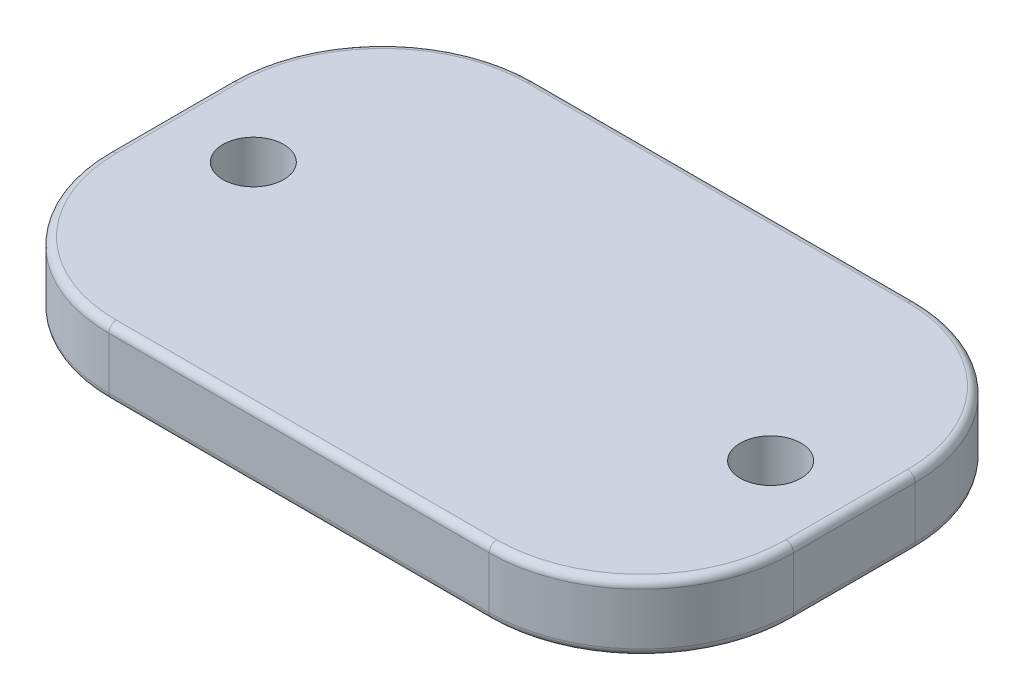
ISO-10303-21;
HEADER;
FILE_DESCRIPTION(('STEP AP214'),'2;1');
FILE_NAME('part.step','',(''),(''),'','','');
FILE_SCHEMA(('AUTOMOTIVE_DESIGN { 1 0 10303 214 1 1 1 1 }'));
ENDSEC;
DATA;
#1=APPLICATION_CONTEXT('core data for automotive mechanical design processes');
#2=APPLICATION_PROTOCOL_DEFINITION('international standard','automotive_design',2000,#1);
#3=PRODUCT_CONTEXT('',#1,'mechanical');
#4=PRODUCT('Part','Part','',(#3));
#5=PRODUCT_RELATED_PRODUCT_CATEGORY('part','',(#4));
#6=PRODUCT_DEFINITION_FORMATION('','',#4);
#7=PRODUCT_DEFINITION_CONTEXT('part definition',#1,'design');
#8=PRODUCT_DEFINITION('design','',#6,#7);
#9=PRODUCT_DEFINITION_SHAPE('','',#8);
#10=(LENGTH_UNIT() NAMED_UNIT(*) SI_UNIT(.MILLI.,.METRE.));
#11=(NAMED_UNIT(*) PLANE_ANGLE_UNIT() SI_UNIT($,.RADIAN.));
#12=(NAMED_UNIT(*) SI_UNIT($,.STERADIAN.) SOLID_ANGLE_UNIT());
#13=UNCERTAINTY_MEASURE_WITH_UNIT(LENGTH_MEASURE(1.E-05),#10,'distance_accuracy_value','');
#14=(GEOMETRIC_REPRESENTATION_CONTEXT(3) GLOBAL_UNCERTAINTY_ASSIGNED_CONTEXT((#13)) GLOBAL_UNIT_ASSIGNED_CONTEXT((#10,
#11,#12)) REPRESENTATION_CONTEXT('',''));
#15=CARTESIAN_POINT('',(0.,0.,0.));
#16=DIRECTION('',(0.,0.,1.));
#17=DIRECTION('',(1.,0.,0.));
#18=AXIS2_PLACEMENT_3D('',#15,#16,#17);
#19=CARTESIAN_POINT('',(0.,-3.1,0.));
#20=DIRECTION('',(0.,0.,1.));
#21=DIRECTION('',(1.,0.,0.));
#22=AXIS2_PLACEMENT_3D('',#19,#20,#21);
#23=SPHERICAL_SURFACE('',#22,6.);
#24=CARTESIAN_POINT('',(0.,-3.1,6.));
#25=VERTEX_POINT('',#24);
#26=VERTEX_LOOP('',#25);
#27=FACE_BOUND('',#26,.T.);
#28=ADVANCED_FACE('F55',(#27),#23,.T.);
#29=CLOSED_SHELL('',(#28));
#30=MANIFOLD_SOLID_BREP('B2',#29);
#31=CARTESIAN_POINT('',(22.5,4.4,14.));
#32=DIRECTION('',(-1.,0.,0.));
#33=DIRECTION('',(0.,0.,1.));
#34=AXIS2_PLACEMENT_3D('',#31,#32,#33);
#35=PLANE('',#34);
#36=DIRECTION('',(0.,-1.,0.));
#37=VECTOR('',#36,1.);
#38=CARTESIAN_POINT('',(22.5,4.4,4.));
#39=LINE('',#38,#37);
#40=CARTESIAN_POINT('',(22.5,3.9,4.));
#41=VERTEX_POINT('',#40);
#42=CARTESIAN_POINT('',(22.5,0.5,4.));
#43=VERTEX_POINT('',#42);
#44=EDGE_CURVE('E232',#41,#43,#39,.T.);
#45=ORIENTED_EDGE('',*,*,#44,.T.);
#46=DIRECTION('',(0.,0.,-1.));
#47=VECTOR('',#46,1.);
#48=CARTESIAN_POINT('',(22.5,0.5,-3.99999999999999));
#49=LINE('',#48,#47);
#50=CARTESIAN_POINT('',(22.5,0.5,-4.));
#51=VERTEX_POINT('',#50);
#52=EDGE_CURVE('E285',#43,#51,#49,.T.);
#53=ORIENTED_EDGE('',*,*,#52,.T.);
#54=DIRECTION('',(0.,-1.,0.));
#55=VECTOR('',#54,1.);
#56=CARTESIAN_POINT('',(22.5,4.4,-4.));
#57=LINE('',#56,#55);
#58=CARTESIAN_POINT('',(22.5,3.9,-4.));
#59=VERTEX_POINT('',#58);
#60=EDGE_CURVE('E402',#51,#59,#57,.F.);
#61=ORIENTED_EDGE('',*,*,#60,.T.);
#62=DIRECTION('',(0.,0.,-1.));
#63=VECTOR('',#62,1.);
#64=CARTESIAN_POINT('',(22.5,3.9,14.));
#65=LINE('',#64,#63);
#66=EDGE_CURVE('E206',#59,#41,#65,.F.);
#67=ORIENTED_EDGE('',*,*,#66,.T.);
#68=EDGE_LOOP('',(#45,#53,#61,#67));
#69=FACE_BOUND('',#68,.T.);
#70=ADVANCED_FACE('F68',(#69),#35,.F.);
#71=CARTESIAN_POINT('',(-22.5,4.4,-14.));
#72=DIRECTION('',(0.,0.,1.));
#73=DIRECTION('',(1.,0.,0.));
#74=AXIS2_PLACEMENT_3D('',#71,#72,#73);
#75=PLANE('',#74);
#76=DIRECTION('',(0.,-1.,0.));
#77=VECTOR('',#76,1.);
#78=CARTESIAN_POINT('',(12.5,4.4,-14.));
#79=LINE('',#78,#77);
#80=CARTESIAN_POINT('',(12.5,3.9,-14.));
#81=VERTEX_POINT('',#80);
#82=CARTESIAN_POINT('',(12.5,0.5,-14.));
#83=VERTEX_POINT('',#82);
#84=EDGE_CURVE('E230',#81,#83,#79,.T.);
#85=ORIENTED_EDGE('',*,*,#84,.T.);
#86=DIRECTION('',(-1.,0.,0.));
#87=VECTOR('',#86,1.);
#88=CARTESIAN_POINT('',(-12.5,0.5,-14.));
#89=LINE('',#88,#87);
#90=CARTESIAN_POINT('',(-12.5,0.5,-14.));
#91=VERTEX_POINT('',#90);
#92=EDGE_CURVE('E297',#83,#91,#89,.T.);
#93=ORIENTED_EDGE('',*,*,#92,.T.);
#94=DIRECTION('',(0.,-1.,0.));
#95=VECTOR('',#94,1.);
#96=CARTESIAN_POINT('',(-12.5,4.4,-14.));
#97=LINE('',#96,#95);
#98=CARTESIAN_POINT('',(-12.5,3.9,-14.));
#99=VERTEX_POINT('',#98);
#100=EDGE_CURVE('E225',#91,#99,#97,.F.);
#101=ORIENTED_EDGE('',*,*,#100,.T.);
#102=DIRECTION('',(-1.,0.,0.));
#103=VECTOR('',#102,1.);
#104=CARTESIAN_POINT('',(-22.5,3.9,-14.));
#105=LINE('',#104,#103);
#106=EDGE_CURVE('E294',#99,#81,#105,.F.);
#107=ORIENTED_EDGE('',*,*,#106,.T.);
#108=EDGE_LOOP('',(#85,#93,#101,#107));
#109=FACE_BOUND('',#108,.T.);
#110=ADVANCED_FACE('F449',(#109),#75,.F.);
#111=CARTESIAN_POINT('',(-22.5,4.4,14.));
#112=DIRECTION('',(1.,0.,0.));
#113=DIRECTION('',(0.,0.,-1.));
#114=AXIS2_PLACEMENT_3D('',#111,#112,#113);
#115=PLANE('',#114);
#116=DIRECTION('',(0.,-1.,0.));
#117=VECTOR('',#116,1.);
#118=CARTESIAN_POINT('',(-22.5,4.4,-4.));
#119=LINE('',#118,#117);
#120=CARTESIAN_POINT('',(-22.5,3.9,-4.));
#121=VERTEX_POINT('',#120);
#122=CARTESIAN_POINT('',(-22.5,0.5,-4.));
#123=VERTEX_POINT('',#122);
#124=EDGE_CURVE('E243',#121,#123,#119,.T.);
#125=ORIENTED_EDGE('',*,*,#124,.T.);
#126=DIRECTION('',(0.,0.,1.));
#127=VECTOR('',#126,1.);
#128=CARTESIAN_POINT('',(-22.5,0.5,4.));
#129=LINE('',#128,#127);
#130=CARTESIAN_POINT('',(-22.5,0.5,4.));
#131=VERTEX_POINT('',#130);
#132=EDGE_CURVE('E310',#123,#131,#129,.T.);
#133=ORIENTED_EDGE('',*,*,#132,.T.);
#134=DIRECTION('',(0.,-1.,0.));
#135=VECTOR('',#134,1.);
#136=CARTESIAN_POINT('',(-22.5,4.4,4.));
#137=LINE('',#136,#135);
#138=CARTESIAN_POINT('',(-22.5,3.9,4.));
#139=VERTEX_POINT('',#138);
#140=EDGE_CURVE('E239',#131,#139,#137,.F.);
#141=ORIENTED_EDGE('',*,*,#140,.T.);
#142=DIRECTION('',(0.,0.,1.));
#143=VECTOR('',#142,1.);
#144=CARTESIAN_POINT('',(-22.5,3.9,14.));
#145=LINE('',#144,#143);
#146=EDGE_CURVE('E306',#139,#121,#145,.F.);
#147=ORIENTED_EDGE('',*,*,#146,.T.);
#148=EDGE_LOOP('',(#125,#133,#141,#147));
#149=FACE_BOUND('',#148,.T.);
#150=ADVANCED_FACE('F455',(#149),#115,.F.);
#151=CARTESIAN_POINT('',(-22.5,4.4,14.));
#152=DIRECTION('',(0.,0.,-1.));
#153=DIRECTION('',(-1.,0.,0.));
#154=AXIS2_PLACEMENT_3D('',#151,#152,#153);
#155=PLANE('',#154);
#156=DIRECTION('',(0.,-1.,0.));
#157=VECTOR('',#156,1.);
#158=CARTESIAN_POINT('',(-12.5,4.4,14.));
#159=LINE('',#158,#157);
#160=CARTESIAN_POINT('',(-12.5,3.9,14.));
#161=VERTEX_POINT('',#160);
#162=CARTESIAN_POINT('',(-12.5,0.5,14.));
#163=VERTEX_POINT('',#162);
#164=EDGE_CURVE('E216',#161,#163,#159,.T.);
#165=ORIENTED_EDGE('',*,*,#164,.T.);
#166=DIRECTION('',(1.,0.,0.));
#167=VECTOR('',#166,1.);
#168=CARTESIAN_POINT('',(12.5,0.5,14.));
#169=LINE('',#168,#167);
#170=CARTESIAN_POINT('',(12.5,0.5,14.));
#171=VERTEX_POINT('',#170);
#172=EDGE_CURVE('E188',#163,#171,#169,.T.);
#173=ORIENTED_EDGE('',*,*,#172,.T.);
#174=DIRECTION('',(0.,-1.,0.));
#175=VECTOR('',#174,1.);
#176=CARTESIAN_POINT('',(12.5,4.4,14.));
#177=LINE('',#176,#175);
#178=CARTESIAN_POINT('',(12.5,3.9,14.));
#179=VERTEX_POINT('',#178);
#180=EDGE_CURVE('E213',#171,#179,#177,.F.);
#181=ORIENTED_EDGE('',*,*,#180,.T.);
#182=DIRECTION('',(1.,0.,0.));
#183=VECTOR('',#182,1.);
#184=CARTESIAN_POINT('',(-22.5,3.9,14.));
#185=LINE('',#184,#183);
#186=EDGE_CURVE('E220',#179,#161,#185,.F.);
#187=ORIENTED_EDGE('',*,*,#186,.T.);
#188=EDGE_LOOP('',(#165,#173,#181,#187));
#189=FACE_BOUND('',#188,.T.);
#190=ADVANCED_FACE('F212',(#189),#155,.F.);
#191=CARTESIAN_POINT('',(0.,4.4,0.));
#192=DIRECTION('',(0.,-1.,0.));
#193=DIRECTION('',(0.,0.,-1.));
#194=AXIS2_PLACEMENT_3D('',#191,#192,#193);
#195=PLANE('',#194);
#196=CARTESIAN_POINT('',(-12.5,4.4,-4.));
#197=DIRECTION('',(0.,-1.,0.));
#198=DIRECTION('',(0.,0.,-1.));
#199=AXIS2_PLACEMENT_3D('',#196,#197,#198);
#200=CIRCLE('',#199,9.5);
#201=CARTESIAN_POINT('',(-12.5,4.4,-13.5));
#202=VERTEX_POINT('',#201);
#203=CARTESIAN_POINT('',(-22.,4.4,-4.));
#204=VERTEX_POINT('',#203);
#205=EDGE_CURVE('E86',#202,#204,#200,.F.);
#206=ORIENTED_EDGE('',*,*,#205,.T.);
#207=DIRECTION('',(0.,0.,1.));
#208=VECTOR('',#207,1.);
#209=CARTESIAN_POINT('',(-22.,4.4,0.));
#210=LINE('',#209,#208);
#211=CARTESIAN_POINT('',(-22.,4.4,4.));
#212=VERTEX_POINT('',#211);
#213=EDGE_CURVE('E332',#204,#212,#210,.T.);
#214=ORIENTED_EDGE('',*,*,#213,.T.);
#215=CARTESIAN_POINT('',(-12.5,4.4,4.));
#216=DIRECTION('',(0.,-1.,0.));
#217=DIRECTION('',(0.,0.,-1.));
#218=AXIS2_PLACEMENT_3D('',#215,#216,#217);
#219=CIRCLE('',#218,9.5);
#220=CARTESIAN_POINT('',(-12.5,4.4,13.5));
#221=VERTEX_POINT('',#220);
#222=EDGE_CURVE('E313',#212,#221,#219,.F.);
#223=ORIENTED_EDGE('',*,*,#222,.T.);
#224=DIRECTION('',(1.,0.,0.));
#225=VECTOR('',#224,1.);
#226=CARTESIAN_POINT('',(0.,4.4,13.5));
#227=LINE('',#226,#225);
#228=CARTESIAN_POINT('',(12.5,4.4,13.5));
#229=VERTEX_POINT('',#228);
#230=EDGE_CURVE('E316',#221,#229,#227,.T.);
#231=ORIENTED_EDGE('',*,*,#230,.T.);
#232=CARTESIAN_POINT('',(12.5,4.4,4.));
#233=DIRECTION('',(0.,-1.,0.));
#234=DIRECTION('',(0.,0.,-1.));
#235=AXIS2_PLACEMENT_3D('',#232,#233,#234);
#236=CIRCLE('',#235,9.5);
#237=CARTESIAN_POINT('',(22.,4.4,4.));
#238=VERTEX_POINT('',#237);
#239=EDGE_CURVE('E319',#229,#238,#236,.F.);
#240=ORIENTED_EDGE('',*,*,#239,.T.);
#241=DIRECTION('',(0.,0.,-1.));
#242=VECTOR('',#241,1.);
#243=CARTESIAN_POINT('',(22.,4.4,0.));
#244=LINE('',#243,#242);
#245=CARTESIAN_POINT('',(22.,4.4,-4.));
#246=VERTEX_POINT('',#245);
#247=EDGE_CURVE('E322',#238,#246,#244,.T.);
#248=ORIENTED_EDGE('',*,*,#247,.T.);
#249=CARTESIAN_POINT('',(12.5,4.4,-4.));
#250=DIRECTION('',(0.,-1.,0.));
#251=DIRECTION('',(0.,0.,-1.));
#252=AXIS2_PLACEMENT_3D('',#249,#250,#251);
#253=CIRCLE('',#252,9.5);
#254=CARTESIAN_POINT('',(12.5,4.4,-13.5));
#255=VERTEX_POINT('',#254);
#256=EDGE_CURVE('E325',#246,#255,#253,.F.);
#257=ORIENTED_EDGE('',*,*,#256,.T.);
#258=DIRECTION('',(-1.,0.,0.));
#259=VECTOR('',#258,1.);
#260=CARTESIAN_POINT('',(0.,4.4,-13.5));
#261=LINE('',#260,#259);
#262=EDGE_CURVE('E91',#255,#202,#261,.T.);
#263=ORIENTED_EDGE('',*,*,#262,.T.);
#264=EDGE_LOOP('',(#206,#214,#223,#231,#240,#248,#257,#263));
#265=FACE_BOUND('',#264,.T.);
#266=CARTESIAN_POINT('',(-17.,4.4,0.));
#267=DIRECTION('',(0.,1.,0.));
#268=DIRECTION('',(0.,0.,1.));
#269=AXIS2_PLACEMENT_3D('',#266,#267,#268);
#270=CIRCLE('',#269,2.);
#271=CARTESIAN_POINT('',(-17.,4.4,2.));
#272=VERTEX_POINT('',#271);
#273=EDGE_CURVE('E415',#272,#272,#270,.T.);
#274=ORIENTED_EDGE('',*,*,#273,.F.);
#275=EDGE_LOOP('',(#274));
#276=FACE_BOUND('',#275,.T.);
#277=CARTESIAN_POINT('',(17.,4.4,0.));
#278=DIRECTION('',(0.,1.,0.));
#279=DIRECTION('',(0.,0.,1.));
#280=AXIS2_PLACEMENT_3D('',#277,#278,#279);
#281=CIRCLE('',#280,2.);
#282=CARTESIAN_POINT('',(17.,4.4,2.));
#283=VERTEX_POINT('',#282);
#284=EDGE_CURVE('E411',#283,#283,#281,.T.);
#285=ORIENTED_EDGE('',*,*,#284,.F.);
#286=EDGE_LOOP('',(#285));
#287=FACE_BOUND('',#286,.T.);
#288=ADVANCED_FACE('F433',(#265,#276,#287),#195,.F.);
#289=CARTESIAN_POINT('',(0.,0.,0.));
#290=DIRECTION('',(0.,-1.,0.));
#291=DIRECTION('',(0.,0.,-1.));
#292=AXIS2_PLACEMENT_3D('',#289,#290,#291);
#293=PLANE('',#292);
#294=CARTESIAN_POINT('',(12.5,0.,4.));
#295=DIRECTION('',(0.,-1.,0.));
#296=DIRECTION('',(0.,0.,-1.));
#297=AXIS2_PLACEMENT_3D('',#294,#295,#296);
#298=CIRCLE('',#297,9.5);
#299=CARTESIAN_POINT('',(22.,0.,4.));
#300=VERTEX_POINT('',#299);
#301=CARTESIAN_POINT('',(12.5,0.,13.5));
#302=VERTEX_POINT('',#301);
#303=EDGE_CURVE('E276',#300,#302,#298,.T.);
#304=ORIENTED_EDGE('',*,*,#303,.T.);
#305=DIRECTION('',(1.,0.,0.));
#306=VECTOR('',#305,1.);
#307=CARTESIAN_POINT('',(-12.5,0.,13.5));
#308=LINE('',#307,#306);
#309=CARTESIAN_POINT('',(-12.5,0.,13.5));
#310=VERTEX_POINT('',#309);
#311=EDGE_CURVE('E190',#302,#310,#308,.F.);
#312=ORIENTED_EDGE('',*,*,#311,.T.);
#313=CARTESIAN_POINT('',(-12.5,0.,4.));
#314=DIRECTION('',(0.,-1.,0.));
#315=DIRECTION('',(0.,0.,-1.));
#316=AXIS2_PLACEMENT_3D('',#313,#314,#315);
#317=CIRCLE('',#316,9.5);
#318=CARTESIAN_POINT('',(-22.,0.,4.));
#319=VERTEX_POINT('',#318);
#320=EDGE_CURVE('E219',#310,#319,#317,.T.);
#321=ORIENTED_EDGE('',*,*,#320,.T.);
#322=DIRECTION('',(0.,0.,1.));
#323=VECTOR('',#322,1.);
#324=CARTESIAN_POINT('',(-22.,0.,-4.));
#325=LINE('',#324,#323);
#326=CARTESIAN_POINT('',(-22.,0.,-4.));
#327=VERTEX_POINT('',#326);
#328=EDGE_CURVE('E261',#319,#327,#325,.F.);
#329=ORIENTED_EDGE('',*,*,#328,.T.);
#330=CARTESIAN_POINT('',(-12.5,0.,-4.));
#331=DIRECTION('',(0.,-1.,0.));
#332=DIRECTION('',(0.,0.,-1.));
#333=AXIS2_PLACEMENT_3D('',#330,#331,#332);
#334=CIRCLE('',#333,9.5);
#335=CARTESIAN_POINT('',(-12.5,0.,-13.5));
#336=VERTEX_POINT('',#335);
#337=EDGE_CURVE('E264',#327,#336,#334,.T.);
#338=ORIENTED_EDGE('',*,*,#337,.T.);
#339=DIRECTION('',(-1.,0.,0.));
#340=VECTOR('',#339,1.);
#341=CARTESIAN_POINT('',(12.5,0.,-13.5));
#342=LINE('',#341,#340);
#343=CARTESIAN_POINT('',(12.5,0.,-13.5));
#344=VERTEX_POINT('',#343);
#345=EDGE_CURVE('E267',#336,#344,#342,.F.);
#346=ORIENTED_EDGE('',*,*,#345,.T.);
#347=CARTESIAN_POINT('',(12.5,0.,-4.));
#348=DIRECTION('',(0.,-1.,0.));
#349=DIRECTION('',(0.,0.,-1.));
#350=AXIS2_PLACEMENT_3D('',#347,#348,#349);
#351=CIRCLE('',#350,9.5);
#352=CARTESIAN_POINT('',(22.,0.,-4.));
#353=VERTEX_POINT('',#352);
#354=EDGE_CURVE('E270',#344,#353,#351,.T.);
#355=ORIENTED_EDGE('',*,*,#354,.T.);
#356=DIRECTION('',(0.,0.,-1.));
#357=VECTOR('',#356,1.);
#358=CARTESIAN_POINT('',(22.,0.,4.00000000000001));
#359=LINE('',#358,#357);
#360=EDGE_CURVE('E273',#353,#300,#359,.F.);
#361=ORIENTED_EDGE('',*,*,#360,.T.);
#362=EDGE_LOOP('',(#304,#312,#321,#329,#338,#346,#355,#361));
#363=FACE_BOUND('',#362,.T.);
#364=CARTESIAN_POINT('',(0.,0.,0.));
#365=DIRECTION('',(0.,-1.,0.));
#366=DIRECTION('',(0.,0.,-1.));
#367=AXIS2_PLACEMENT_3D('',#364,#365,#366);
#368=CIRCLE('',#367,10.3077640640442);
#369=CARTESIAN_POINT('',(-10.3077640640442,0.,0.));
#370=VERTEX_POINT('',#369);
#371=EDGE_CURVE('E248',#370,#370,#368,.F.);
#372=ORIENTED_EDGE('',*,*,#371,.T.);
#373=EDGE_LOOP('',(#372));
#374=FACE_BOUND('',#373,.T.);
#375=CARTESIAN_POINT('',(-17.,0.,0.));
#376=DIRECTION('',(0.,1.,0.));
#377=DIRECTION('',(0.,0.,1.));
#378=AXIS2_PLACEMENT_3D('',#375,#376,#377);
#379=CIRCLE('',#378,2.);
#380=CARTESIAN_POINT('',(-17.,0.,2.));
#381=VERTEX_POINT('',#380);
#382=EDGE_CURVE('E405',#381,#381,#379,.T.);
#383=ORIENTED_EDGE('',*,*,#382,.T.);
#384=EDGE_LOOP('',(#383));
#385=FACE_BOUND('',#384,.T.);
#386=CARTESIAN_POINT('',(17.,0.,0.));
#387=DIRECTION('',(0.,1.,0.));
#388=DIRECTION('',(0.,0.,1.));
#389=AXIS2_PLACEMENT_3D('',#386,#387,#388);
#390=CIRCLE('',#389,2.);
#391=CARTESIAN_POINT('',(17.,0.,2.));
#392=VERTEX_POINT('',#391);
#393=EDGE_CURVE('E252',#392,#392,#390,.T.);
#394=ORIENTED_EDGE('',*,*,#393,.T.);
#395=EDGE_LOOP('',(#394));
#396=FACE_BOUND('',#395,.T.);
#397=ADVANCED_FACE('F423',(#363,#374,#385,#396),#293,.T.);
#398=CARTESIAN_POINT('',(17.,0.,0.));
#399=DIRECTION('',(0.,1.,0.));
#400=DIRECTION('',(0.,0.,1.));
#401=AXIS2_PLACEMENT_3D('',#398,#399,#400);
#402=CYLINDRICAL_SURFACE('',#401,2.);
#403=ORIENTED_EDGE('',*,*,#393,.F.);
#404=EDGE_LOOP('',(#403));
#405=FACE_BOUND('',#404,.T.);
#406=ORIENTED_EDGE('',*,*,#284,.T.);
#407=EDGE_LOOP('',(#406));
#408=FACE_BOUND('',#407,.T.);
#409=ADVANCED_FACE('F429',(#405,#408),#402,.F.);
#410=CARTESIAN_POINT('',(-17.,0.,0.));
#411=DIRECTION('',(0.,1.,0.));
#412=DIRECTION('',(0.,0.,1.));
#413=AXIS2_PLACEMENT_3D('',#410,#411,#412);
#414=CYLINDRICAL_SURFACE('',#413,2.);
#415=ORIENTED_EDGE('',*,*,#382,.F.);
#416=EDGE_LOOP('',(#415));
#417=FACE_BOUND('',#416,.T.);
#418=ORIENTED_EDGE('',*,*,#273,.T.);
#419=EDGE_LOOP('',(#418));
#420=FACE_BOUND('',#419,.T.);
#421=ADVANCED_FACE('F426',(#417,#420),#414,.F.);
#422=CARTESIAN_POINT('',(12.5,4.4,4.));
#423=DIRECTION('',(0.,-1.,0.));
#424=DIRECTION('',(0.,0.,-1.));
#425=AXIS2_PLACEMENT_3D('',#422,#423,#424);
#426=CYLINDRICAL_SURFACE('',#425,10.);
#427=ORIENTED_EDGE('',*,*,#180,.F.);
#428=CARTESIAN_POINT('',(12.5,0.5,4.));
#429=DIRECTION('',(0.,-1.,0.));
#430=DIRECTION('',(0.,0.,-1.));
#431=AXIS2_PLACEMENT_3D('',#428,#429,#430);
#432=CIRCLE('',#431,10.);
#433=EDGE_CURVE('E197',#171,#43,#432,.F.);
#434=ORIENTED_EDGE('',*,*,#433,.T.);
#435=ORIENTED_EDGE('',*,*,#44,.F.);
#436=CARTESIAN_POINT('',(12.5,3.9,4.));
#437=DIRECTION('',(0.,-1.,0.));
#438=DIRECTION('',(0.,0.,-1.));
#439=AXIS2_PLACEMENT_3D('',#436,#437,#438);
#440=CIRCLE('',#439,10.);
#441=EDGE_CURVE('E207',#41,#179,#440,.T.);
#442=ORIENTED_EDGE('',*,*,#441,.T.);
#443=EDGE_LOOP('',(#427,#434,#435,#442));
#444=FACE_BOUND('',#443,.T.);
#445=ADVANCED_FACE('F222',(#444),#426,.T.);
#446=CARTESIAN_POINT('',(12.5,4.4,-4.));
#447=DIRECTION('',(0.,-1.,0.));
#448=DIRECTION('',(0.,0.,-1.));
#449=AXIS2_PLACEMENT_3D('',#446,#447,#448);
#450=CYLINDRICAL_SURFACE('',#449,10.);
#451=ORIENTED_EDGE('',*,*,#60,.F.);
#452=CARTESIAN_POINT('',(12.5,0.5,-4.));
#453=DIRECTION('',(0.,-1.,0.));
#454=DIRECTION('',(0.,0.,-1.));
#455=AXIS2_PLACEMENT_3D('',#452,#453,#454);
#456=CIRCLE('',#455,10.);
#457=EDGE_CURVE('E291',#51,#83,#456,.F.);
#458=ORIENTED_EDGE('',*,*,#457,.T.);
#459=ORIENTED_EDGE('',*,*,#84,.F.);
#460=CARTESIAN_POINT('',(12.5,3.9,-4.));
#461=DIRECTION('',(0.,-1.,0.));
#462=DIRECTION('',(0.,0.,-1.));
#463=AXIS2_PLACEMENT_3D('',#460,#461,#462);
#464=CIRCLE('',#463,10.);
#465=EDGE_CURVE('E288',#81,#59,#464,.T.);
#466=ORIENTED_EDGE('',*,*,#465,.T.);
#467=EDGE_LOOP('',(#451,#458,#459,#466));
#468=FACE_BOUND('',#467,.T.);
#469=ADVANCED_FACE('F462',(#468),#450,.T.);
#470=CARTESIAN_POINT('',(-12.5,4.4,-4.));
#471=DIRECTION('',(0.,-1.,0.));
#472=DIRECTION('',(0.,0.,-1.));
#473=AXIS2_PLACEMENT_3D('',#470,#471,#472);
#474=CYLINDRICAL_SURFACE('',#473,10.);
#475=ORIENTED_EDGE('',*,*,#100,.F.);
#476=CARTESIAN_POINT('',(-12.5,0.5,-4.));
#477=DIRECTION('',(0.,-1.,0.));
#478=DIRECTION('',(0.,0.,-1.));
#479=AXIS2_PLACEMENT_3D('',#476,#477,#478);
#480=CIRCLE('',#479,10.);
#481=EDGE_CURVE('E303',#91,#123,#480,.F.);
#482=ORIENTED_EDGE('',*,*,#481,.T.);
#483=ORIENTED_EDGE('',*,*,#124,.F.);
#484=CARTESIAN_POINT('',(-12.5,3.9,-4.));
#485=DIRECTION('',(0.,-1.,0.));
#486=DIRECTION('',(0.,0.,-1.));
#487=AXIS2_PLACEMENT_3D('',#484,#485,#486);
#488=CIRCLE('',#487,10.);
#489=EDGE_CURVE('E300',#121,#99,#488,.T.);
#490=ORIENTED_EDGE('',*,*,#489,.T.);
#491=EDGE_LOOP('',(#475,#482,#483,#490));
#492=FACE_BOUND('',#491,.T.);
#493=ADVANCED_FACE('F465',(#492),#474,.T.);
#494=CARTESIAN_POINT('',(-12.5,4.4,4.));
#495=DIRECTION('',(0.,-1.,0.));
#496=DIRECTION('',(0.,0.,-1.));
#497=AXIS2_PLACEMENT_3D('',#494,#495,#496);
#498=CYLINDRICAL_SURFACE('',#497,10.);
#499=ORIENTED_EDGE('',*,*,#140,.F.);
#500=CARTESIAN_POINT('',(-12.5,0.5,4.));
#501=DIRECTION('',(0.,-1.,0.));
#502=DIRECTION('',(0.,0.,-1.));
#503=AXIS2_PLACEMENT_3D('',#500,#501,#502);
#504=CIRCLE('',#503,10.);
#505=EDGE_CURVE('E53',#131,#163,#504,.F.);
#506=ORIENTED_EDGE('',*,*,#505,.T.);
#507=ORIENTED_EDGE('',*,*,#164,.F.);
#508=CARTESIAN_POINT('',(-12.5,3.9,4.));
#509=DIRECTION('',(0.,-1.,0.));
#510=DIRECTION('',(0.,0.,-1.));
#511=AXIS2_PLACEMENT_3D('',#508,#509,#510);
#512=CIRCLE('',#511,10.);
#513=EDGE_CURVE('E78',#161,#139,#512,.T.);
#514=ORIENTED_EDGE('',*,*,#513,.T.);
#515=EDGE_LOOP('',(#499,#506,#507,#514));
#516=FACE_BOUND('',#515,.T.);
#517=ADVANCED_FACE('F469',(#516),#498,.T.);
#518=CARTESIAN_POINT('',(0.,2.,0.));
#519=DIRECTION('',(0.,1.,0.));
#520=DIRECTION('',(-1.,0.,0.));
#521=AXIS2_PLACEMENT_3D('',#518,#519,#520);
#522=SPHERICAL_SURFACE('',#521,10.5);
#523=CARTESIAN_POINT('',(0.,-6.1,0.));
#524=DIRECTION('',(0.,1.,0.));
#525=DIRECTION('',(0.,0.,1.));
#526=AXIS2_PLACEMENT_3D('',#523,#524,#525);
#527=CIRCLE('',#526,6.68131723539603);
#528=CARTESIAN_POINT('',(-6.68131723539603,-6.1,0.));
#529=VERTEX_POINT('',#528);
#530=EDGE_CURVE('E247',#529,#529,#527,.T.);
#531=CARTESIAN_POINT('',(-6.68131723539603,-6.1,0.));
#532=CARTESIAN_POINT('',(-6.73948848435108,-6.05201738928683,0.));
#533=CARTESIAN_POINT('',(-6.79714266944517,-6.00340793149048,0.));
#534=CARTESIAN_POINT('',(-6.91139053915621,-5.90495833499564,0.));
#535=CARTESIAN_POINT('',(-6.96798422377316,-5.85511819629715,0.));
#536=CARTESIAN_POINT('',(-7.08008471977472,-5.75423025126227,0.));
#537=CARTESIAN_POINT('',(-7.13559153115932,-5.70318244492588,0.));
#538=CARTESIAN_POINT('',(-7.24549254432489,-5.59990289149744,0.));
#539=CARTESIAN_POINT('',(-7.29988674610585,-5.54767114440539,0.));
#540=CARTESIAN_POINT('',(-7.40753728478411,-5.44204794487713,0.));
#541=CARTESIAN_POINT('',(-7.4607936216814,-5.38865649244093,0.));
#542=CARTESIAN_POINT('',(-7.56614371293761,-5.28073866691834,0.));
#543=CARTESIAN_POINT('',(-7.61823746729652,-5.22621229383197,0.));
#544=CARTESIAN_POINT('',(-7.72123821291237,-5.11604993554733,0.));
#545=CARTESIAN_POINT('',(-7.7721452041693,-5.06041395034908,0.));
#546=CARTESIAN_POINT('',(-7.87274879454982,-4.9480581922096,0.));
#547=CARTESIAN_POINT('',(-7.92244539367339,-4.89133841926838,0.));
#548=CARTESIAN_POINT('',(-8.02060513239365,-4.77684141285534,0.));
#549=CARTESIAN_POINT('',(-8.06906827199033,-4.71906417938353,0.));
#550=CARTESIAN_POINT('',(-8.16473859683917,-4.60247907001308,0.));
#551=CARTESIAN_POINT('',(-8.21194578209132,-4.54367119411444,0.));
#552=CARTESIAN_POINT('',(-8.30508228638875,-4.42505209636569,0.));
#553=CARTESIAN_POINT('',(-8.35101160543402,-4.36524087451557,0.));
#554=CARTESIAN_POINT('',(-8.44157105859786,-4.24464284705999,0.));
#555=CARTESIAN_POINT('',(-8.48620119271644,-4.18385604145453,0.));
#556=CARTESIAN_POINT('',(-8.57414156034057,-4.06133506151382,0.));
#557=CARTESIAN_POINT('',(-8.61745179384614,-3.99960088717858,0.));
#558=CARTESIAN_POINT('',(-8.70273225720807,-3.8752138245383,0.));
#559=CARTESIAN_POINT('',(-8.74470248706444,-3.81256093623326,0.));
#560=CARTESIAN_POINT('',(-8.82728346207273,-3.68636552684693,0.));
#561=CARTESIAN_POINT('',(-8.86789420722465,-3.62282300576564,0.));
#562=CARTESIAN_POINT('',(-8.94773736279219,-3.49487782495558,0.));
#563=CARTESIAN_POINT('',(-8.98696977320781,-3.4304751652268,0.));
#564=CARTESIAN_POINT('',(-9.06403804904378,-3.30083960049562,0.));
#565=CARTESIAN_POINT('',(-9.10187391446413,-3.23560669549321,0.));
#566=CARTESIAN_POINT('',(-9.17613153827602,-3.1043409189583,0.));
#567=CARTESIAN_POINT('',(-9.21255329666756,-3.03830804742579,0.));
#568=CARTESIAN_POINT('',(-9.28396580076538,-2.90547298788961,0.));
#569=CARTESIAN_POINT('',(-9.31895654647166,-2.83867079988593,0.));
#570=CARTESIAN_POINT('',(-9.38749078376659,-2.70432811455508,0.));
#571=CARTESIAN_POINT('',(-9.42103427535524,-2.6367876172279,0.));
#572=CARTESIAN_POINT('',(-9.48665843474523,-2.50099966309404,0.));
#573=CARTESIAN_POINT('',(-9.51873910254656,-2.43275220628737,0.));
#574=CARTESIAN_POINT('',(-9.58142272368222,-2.2955820111835,0.));
#575=CARTESIAN_POINT('',(-9.61202567701655,-2.22665927288631,0.));
#576=CARTESIAN_POINT('',(-9.67173966443844,-2.08817050623121,0.));
#577=CARTESIAN_POINT('',(-9.70085069852601,-2.01860447787331,0.));
#578=CARTESIAN_POINT('',(-9.75756733517459,-1.87886142111958,0.));
#579=CARTESIAN_POINT('',(-9.78517293773559,-1.80868439272376,0.));
#580=CARTESIAN_POINT('',(-9.83886589779824,-1.66775190951677,0.));
#581=CARTESIAN_POINT('',(-9.86495325529989,-1.59699645470561,0.));
#582=CARTESIAN_POINT('',(-9.91559761649828,-1.45493996079085,0.));
#583=CARTESIAN_POINT('',(-9.94015462019502,-1.38363892168726,0.));
#584=CARTESIAN_POINT('',(-9.98772687509994,-1.2405243544919,0.));
#585=CARTESIAN_POINT('',(-10.0107421263081,-1.16871082640014,0.));
#586=CARTESIAN_POINT('',(-10.0552201941956,-1.02460461463185,0.));
#587=CARTESIAN_POINT('',(-10.0766830108749,-0.952311930955313,0.));
#588=CARTESIAN_POINT('',(-10.1180462444491,-0.807280963005043,0.));
#589=CARTESIAN_POINT('',(-10.137946661344,-0.734542678731309,0.));
#590=CARTESIAN_POINT('',(-10.1761758694811,-0.588654274475148,0.));
#591=CARTESIAN_POINT('',(-10.1945046607233,-0.515504154492722,0.));
#592=CARTESIAN_POINT('',(-10.2295820682644,-0.368826023411951,0.));
#593=CARTESIAN_POINT('',(-10.2463306845633,-0.295298012313605,0.));
#594=CARTESIAN_POINT('',(-10.2782401238646,-0.147898261747369,0.));
#595=CARTESIAN_POINT('',(-10.2934009468669,-0.0740265222794777,0.));
#596=CARTESIAN_POINT('',(-10.3077640640442,0.,0.));
#597=B_SPLINE_CURVE_WITH_KNOTS('',3,(#531,#532,#533,#534,#535,#536,#537,#538,#539,#540,#541,
#542,#543,#544,#545,#546,#547,#548,#549,#550,#551,#552,#553,#554,#555,#556,#557,#558,#559,#560,
#561,#562,#563,#564,#565,#566,#567,#568,#569,#570,#571,#572,#573,#574,#575,#576,#577,#578,#579,
#580,#581,#582,#583,#584,#585,#586,#587,#588,#589,#590,#591,#592,#593,#594,#595,#596),
.UNSPECIFIED.,.F.,.F.,(4,2,2,2,2,2,2,2,2,2,2,2,2,2,2,2,2,2,2,2,2,2,2,2,2,2,2,2,2,2,2,2,4),(0.,
0.226216804935737,0.452433609871474,0.678650414807211,0.90486721974295,1.13108402467869,
1.35730082961442,1.58351763455016,1.8097344394859,2.03595124442164,2.26216804935737,
2.48838485429311,2.71460165922885,2.94081846416459,3.16703526910032,3.39325207403606,
3.6194688789718,3.84568568390754,4.07190248884327,4.29811929377901,4.52433609871475,
4.75055290365049,4.97676970858623,5.20298651352196,5.4292033184577,5.65542012339344,
5.88163692832917,6.10785373326491,6.33407053820065,6.56028734313639,6.78650414807213,
7.01272095300786,7.2389377579436),.UNSPECIFIED.);
#598=EDGE_CURVE('BSEAM473',#529,#370,#597,.T.);
#599=ORIENTED_EDGE('',*,*,#530,.T.);
#600=ORIENTED_EDGE('',*,*,#371,.F.);
#601=ORIENTED_EDGE('',*,*,#598,.T.);
#602=ORIENTED_EDGE('',*,*,#598,.F.);
#603=EDGE_LOOP('',(#599,#601,#600,#602));
#604=FACE_BOUND('',#603,.T.);
#605=ADVANCED_FACE('F473',(#604),#522,.T.);
#606=CARTESIAN_POINT('',(-6.68131723539603,-6.1,-12.2));
#607=DIRECTION('',(0.,1.,0.));
#608=DIRECTION('',(0.,0.,1.));
#609=AXIS2_PLACEMENT_3D('',#606,#607,#608);
#610=PLANE('',#609);
#611=ORIENTED_EDGE('',*,*,#530,.F.);
#612=EDGE_LOOP('',(#611));
#613=FACE_BOUND('',#612,.T.);
#614=ADVANCED_FACE('F502',(#613),#610,.F.);
#615=CARTESIAN_POINT('',(-22.5,0.5,-13.5));
#616=DIRECTION('',(1.,0.,0.));
#617=DIRECTION('',(0.,0.,-1.));
#618=AXIS2_PLACEMENT_3D('',#615,#616,#617);
#619=CYLINDRICAL_SURFACE('',#618,0.5);
#620=CARTESIAN_POINT('',(12.5,0.5,-13.5));
#621=DIRECTION('',(1.,0.,0.));
#622=DIRECTION('',(0.,0.,-1.));
#623=AXIS2_PLACEMENT_3D('',#620,#621,#622);
#624=CIRCLE('',#623,0.5);
#625=EDGE_CURVE('E353',#344,#83,#624,.T.);
#626=ORIENTED_EDGE('',*,*,#625,.F.);
#627=ORIENTED_EDGE('',*,*,#345,.F.);
#628=CARTESIAN_POINT('',(-12.5,0.5,-13.5));
#629=DIRECTION('',(-1.,0.,0.));
#630=DIRECTION('',(0.,0.,1.));
#631=AXIS2_PLACEMENT_3D('',#628,#629,#630);
#632=CIRCLE('',#631,0.5);
#633=EDGE_CURVE('E253',#91,#336,#632,.T.);
#634=ORIENTED_EDGE('',*,*,#633,.F.);
#635=ORIENTED_EDGE('',*,*,#92,.F.);
#636=EDGE_LOOP('',(#626,#627,#634,#635));
#637=FACE_BOUND('',#636,.T.);
#638=ADVANCED_FACE('F498',(#637),#619,.T.);
#639=CARTESIAN_POINT('',(-12.5,0.5,-4.));
#640=DIRECTION('',(0.,-1.,0.));
#641=DIRECTION('',(0.,0.,-1.));
#642=AXIS2_PLACEMENT_3D('',#639,#640,#641);
#643=TOROIDAL_SURFACE('',#642,9.5,0.5);
#644=ORIENTED_EDGE('',*,*,#633,.T.);
#645=ORIENTED_EDGE('',*,*,#337,.F.);
#646=CARTESIAN_POINT('',(-22.,0.5,-4.));
#647=DIRECTION('',(0.,0.,1.));
#648=DIRECTION('',(1.,0.,0.));
#649=AXIS2_PLACEMENT_3D('',#646,#647,#648);
#650=CIRCLE('',#649,0.5);
#651=EDGE_CURVE('E349',#123,#327,#650,.T.);
#652=ORIENTED_EDGE('',*,*,#651,.F.);
#653=ORIENTED_EDGE('',*,*,#481,.F.);
#654=EDGE_LOOP('',(#644,#645,#652,#653));
#655=FACE_BOUND('',#654,.T.);
#656=ADVANCED_FACE('F494',(#655),#643,.T.);
#657=CARTESIAN_POINT('',(12.5,0.5,-4.));
#658=DIRECTION('',(0.,-1.,0.));
#659=DIRECTION('',(0.,0.,-1.));
#660=AXIS2_PLACEMENT_3D('',#657,#658,#659);
#661=TOROIDAL_SURFACE('',#660,9.5,0.5);
#662=ORIENTED_EDGE('',*,*,#625,.T.);
#663=ORIENTED_EDGE('',*,*,#457,.F.);
#664=CARTESIAN_POINT('',(22.,0.5,-4.));
#665=DIRECTION('',(0.,0.,1.));
#666=DIRECTION('',(1.,0.,0.));
#667=AXIS2_PLACEMENT_3D('',#664,#665,#666);
#668=CIRCLE('',#667,0.5);
#669=EDGE_CURVE('E345',#353,#51,#668,.T.);
#670=ORIENTED_EDGE('',*,*,#669,.F.);
#671=ORIENTED_EDGE('',*,*,#354,.F.);
#672=EDGE_LOOP('',(#662,#663,#670,#671));
#673=FACE_BOUND('',#672,.T.);
#674=ADVANCED_FACE('F490',(#673),#661,.T.);
#675=CARTESIAN_POINT('',(-22.,0.5,14.));
#676=DIRECTION('',(0.,0.,-1.));
#677=DIRECTION('',(-1.,0.,0.));
#678=AXIS2_PLACEMENT_3D('',#675,#676,#677);
#679=CYLINDRICAL_SURFACE('',#678,0.5);
#680=ORIENTED_EDGE('',*,*,#651,.T.);
#681=ORIENTED_EDGE('',*,*,#328,.F.);
#682=CARTESIAN_POINT('',(-22.,0.5,4.));
#683=DIRECTION('',(0.,0.,1.));
#684=DIRECTION('',(1.,0.,0.));
#685=AXIS2_PLACEMENT_3D('',#682,#683,#684);
#686=CIRCLE('',#685,0.5);
#687=EDGE_CURVE('E341',#131,#319,#686,.T.);
#688=ORIENTED_EDGE('',*,*,#687,.F.);
#689=ORIENTED_EDGE('',*,*,#132,.F.);
#690=EDGE_LOOP('',(#680,#681,#688,#689));
#691=FACE_BOUND('',#690,.T.);
#692=ADVANCED_FACE('F486',(#691),#679,.T.);
#693=CARTESIAN_POINT('',(22.,0.5,14.));
#694=DIRECTION('',(0.,0.,1.));
#695=DIRECTION('',(1.,0.,0.));
#696=AXIS2_PLACEMENT_3D('',#693,#694,#695);
#697=CYLINDRICAL_SURFACE('',#696,0.5);
#698=ORIENTED_EDGE('',*,*,#669,.T.);
#699=ORIENTED_EDGE('',*,*,#52,.F.);
#700=CARTESIAN_POINT('',(22.,0.5,4.));
#701=DIRECTION('',(0.,0.,1.));
#702=DIRECTION('',(1.,0.,0.));
#703=AXIS2_PLACEMENT_3D('',#700,#701,#702);
#704=CIRCLE('',#703,0.5);
#705=EDGE_CURVE('E200',#300,#43,#704,.T.);
#706=ORIENTED_EDGE('',*,*,#705,.F.);
#707=ORIENTED_EDGE('',*,*,#360,.F.);
#708=EDGE_LOOP('',(#698,#699,#706,#707));
#709=FACE_BOUND('',#708,.T.);
#710=ADVANCED_FACE('F482',(#709),#697,.T.);
#711=CARTESIAN_POINT('',(-12.5,0.5,4.));
#712=DIRECTION('',(0.,-1.,0.));
#713=DIRECTION('',(0.,0.,-1.));
#714=AXIS2_PLACEMENT_3D('',#711,#712,#713);
#715=TOROIDAL_SURFACE('',#714,9.5,0.5);
#716=ORIENTED_EDGE('',*,*,#687,.T.);
#717=ORIENTED_EDGE('',*,*,#320,.F.);
#718=CARTESIAN_POINT('',(-12.5,0.5,13.5));
#719=DIRECTION('',(1.,0.,0.));
#720=DIRECTION('',(0.,0.,-1.));
#721=AXIS2_PLACEMENT_3D('',#718,#719,#720);
#722=CIRCLE('',#721,0.5);
#723=EDGE_CURVE('E194',#163,#310,#722,.T.);
#724=ORIENTED_EDGE('',*,*,#723,.F.);
#725=ORIENTED_EDGE('',*,*,#505,.F.);
#726=EDGE_LOOP('',(#716,#717,#724,#725));
#727=FACE_BOUND('',#726,.T.);
#728=ADVANCED_FACE('F479',(#727),#715,.T.);
#729=CARTESIAN_POINT('',(12.5,0.5,4.));
#730=DIRECTION('',(0.,-1.,0.));
#731=DIRECTION('',(0.,0.,-1.));
#732=AXIS2_PLACEMENT_3D('',#729,#730,#731);
#733=TOROIDAL_SURFACE('',#732,9.5,0.5);
#734=ORIENTED_EDGE('',*,*,#705,.T.);
#735=ORIENTED_EDGE('',*,*,#433,.F.);
#736=CARTESIAN_POINT('',(12.5,0.5,13.5));
#737=DIRECTION('',(-1.,0.,0.));
#738=DIRECTION('',(0.,0.,1.));
#739=AXIS2_PLACEMENT_3D('',#736,#737,#738);
#740=CIRCLE('',#739,0.5);
#741=EDGE_CURVE('E184',#302,#171,#740,.T.);
#742=ORIENTED_EDGE('',*,*,#741,.F.);
#743=ORIENTED_EDGE('',*,*,#303,.F.);
#744=EDGE_LOOP('',(#734,#735,#742,#743));
#745=FACE_BOUND('',#744,.T.);
#746=ADVANCED_FACE('F198',(#745),#733,.T.);
#747=CARTESIAN_POINT('',(-22.5,0.5,13.5));
#748=DIRECTION('',(-1.,0.,0.));
#749=DIRECTION('',(0.,0.,1.));
#750=AXIS2_PLACEMENT_3D('',#747,#748,#749);
#751=CYLINDRICAL_SURFACE('',#750,0.5);
#752=ORIENTED_EDGE('',*,*,#723,.T.);
#753=ORIENTED_EDGE('',*,*,#311,.F.);
#754=ORIENTED_EDGE('',*,*,#741,.T.);
#755=ORIENTED_EDGE('',*,*,#172,.F.);
#756=EDGE_LOOP('',(#752,#753,#754,#755));
#757=FACE_BOUND('',#756,.T.);
#758=ADVANCED_FACE('F186',(#757),#751,.T.);
#759=CARTESIAN_POINT('',(22.,3.9,0.));
#760=DIRECTION('',(0.,0.,-1.));
#761=DIRECTION('',(-1.,0.,0.));
#762=AXIS2_PLACEMENT_3D('',#759,#760,#761);
#763=CYLINDRICAL_SURFACE('',#762,0.5);
#764=CARTESIAN_POINT('',(22.,3.9,4.));
#765=DIRECTION('',(0.,0.,1.));
#766=DIRECTION('',(1.,0.,0.));
#767=AXIS2_PLACEMENT_3D('',#764,#765,#766);
#768=CIRCLE('',#767,0.5);
#769=EDGE_CURVE('E381',#41,#238,#768,.T.);
#770=ORIENTED_EDGE('',*,*,#769,.F.);
#771=ORIENTED_EDGE('',*,*,#66,.F.);
#772=CARTESIAN_POINT('',(22.,3.9,-4.));
#773=DIRECTION('',(0.,0.,-1.));
#774=DIRECTION('',(-1.,0.,0.));
#775=AXIS2_PLACEMENT_3D('',#772,#773,#774);
#776=CIRCLE('',#775,0.5);
#777=EDGE_CURVE('E72',#246,#59,#776,.T.);
#778=ORIENTED_EDGE('',*,*,#777,.F.);
#779=ORIENTED_EDGE('',*,*,#247,.F.);
#780=EDGE_LOOP('',(#770,#771,#778,#779));
#781=FACE_BOUND('',#780,.T.);
#782=ADVANCED_FACE('F70',(#781),#763,.T.);
#783=CARTESIAN_POINT('',(12.5,3.9,-4.));
#784=DIRECTION('',(0.,-1.,0.));
#785=DIRECTION('',(0.,0.,-1.));
#786=AXIS2_PLACEMENT_3D('',#783,#784,#785);
#787=TOROIDAL_SURFACE('',#786,9.5,0.5);
#788=ORIENTED_EDGE('',*,*,#777,.T.);
#789=ORIENTED_EDGE('',*,*,#465,.F.);
#790=CARTESIAN_POINT('',(12.5,3.9,-13.5));
#791=DIRECTION('',(-1.,0.,0.));
#792=DIRECTION('',(0.,0.,1.));
#793=AXIS2_PLACEMENT_3D('',#790,#791,#792);
#794=CIRCLE('',#793,0.5);
#795=EDGE_CURVE('E378',#255,#81,#794,.T.);
#796=ORIENTED_EDGE('',*,*,#795,.F.);
#797=ORIENTED_EDGE('',*,*,#256,.F.);
#798=EDGE_LOOP('',(#788,#789,#796,#797));
#799=FACE_BOUND('',#798,.T.);
#800=ADVANCED_FACE('F393',(#799),#787,.T.);
#801=CARTESIAN_POINT('',(12.5,3.9,4.));
#802=DIRECTION('',(0.,-1.,0.));
#803=DIRECTION('',(0.,0.,-1.));
#804=AXIS2_PLACEMENT_3D('',#801,#802,#803);
#805=TOROIDAL_SURFACE('',#804,9.5,0.5);
#806=ORIENTED_EDGE('',*,*,#769,.T.);
#807=ORIENTED_EDGE('',*,*,#239,.F.);
#808=CARTESIAN_POINT('',(12.5,3.9,13.5));
#809=DIRECTION('',(-1.,0.,0.));
#810=DIRECTION('',(0.,0.,1.));
#811=AXIS2_PLACEMENT_3D('',#808,#809,#810);
#812=CIRCLE('',#811,0.5);
#813=EDGE_CURVE('E374',#179,#229,#812,.T.);
#814=ORIENTED_EDGE('',*,*,#813,.F.);
#815=ORIENTED_EDGE('',*,*,#441,.F.);
#816=EDGE_LOOP('',(#806,#807,#814,#815));
#817=FACE_BOUND('',#816,.T.);
#818=ADVANCED_FACE('F523',(#817),#805,.T.);
#819=CARTESIAN_POINT('',(0.,3.9,-13.5));
#820=DIRECTION('',(-1.,0.,0.));
#821=DIRECTION('',(0.,0.,1.));
#822=AXIS2_PLACEMENT_3D('',#819,#820,#821);
#823=CYLINDRICAL_SURFACE('',#822,0.5);
#824=ORIENTED_EDGE('',*,*,#795,.T.);
#825=ORIENTED_EDGE('',*,*,#106,.F.);
#826=CARTESIAN_POINT('',(-12.5,3.9,-13.5));
#827=DIRECTION('',(-1.,0.,0.));
#828=DIRECTION('',(0.,0.,1.));
#829=AXIS2_PLACEMENT_3D('',#826,#827,#828);
#830=CIRCLE('',#829,0.5);
#831=EDGE_CURVE('E370',#202,#99,#830,.T.);
#832=ORIENTED_EDGE('',*,*,#831,.F.);
#833=ORIENTED_EDGE('',*,*,#262,.F.);
#834=EDGE_LOOP('',(#824,#825,#832,#833));
#835=FACE_BOUND('',#834,.T.);
#836=ADVANCED_FACE('F519',(#835),#823,.T.);
#837=CARTESIAN_POINT('',(0.,3.9,13.5));
#838=DIRECTION('',(1.,0.,0.));
#839=DIRECTION('',(0.,0.,-1.));
#840=AXIS2_PLACEMENT_3D('',#837,#838,#839);
#841=CYLINDRICAL_SURFACE('',#840,0.5);
#842=ORIENTED_EDGE('',*,*,#813,.T.);
#843=ORIENTED_EDGE('',*,*,#230,.F.);
#844=CARTESIAN_POINT('',(-12.5,3.9,13.5));
#845=DIRECTION('',(-1.,0.,0.));
#846=DIRECTION('',(0.,0.,1.));
#847=AXIS2_PLACEMENT_3D('',#844,#845,#846);
#848=CIRCLE('',#847,0.5);
#849=EDGE_CURVE('E366',#161,#221,#848,.T.);
#850=ORIENTED_EDGE('',*,*,#849,.F.);
#851=ORIENTED_EDGE('',*,*,#186,.F.);
#852=EDGE_LOOP('',(#842,#843,#850,#851));
#853=FACE_BOUND('',#852,.T.);
#854=ADVANCED_FACE('F515',(#853),#841,.T.);
#855=CARTESIAN_POINT('',(-12.5,3.9,-4.));
#856=DIRECTION('',(0.,-1.,0.));
#857=DIRECTION('',(0.,0.,-1.));
#858=AXIS2_PLACEMENT_3D('',#855,#856,#857);
#859=TOROIDAL_SURFACE('',#858,9.5,0.5);
#860=ORIENTED_EDGE('',*,*,#831,.T.);
#861=ORIENTED_EDGE('',*,*,#489,.F.);
#862=CARTESIAN_POINT('',(-22.,3.9,-4.));
#863=DIRECTION('',(0.,0.,1.));
#864=DIRECTION('',(1.,0.,0.));
#865=AXIS2_PLACEMENT_3D('',#862,#863,#864);
#866=CIRCLE('',#865,0.5);
#867=EDGE_CURVE('E363',#204,#121,#866,.T.);
#868=ORIENTED_EDGE('',*,*,#867,.F.);
#869=ORIENTED_EDGE('',*,*,#205,.F.);
#870=EDGE_LOOP('',(#860,#861,#868,#869));
#871=FACE_BOUND('',#870,.T.);
#872=ADVANCED_FACE('F511',(#871),#859,.T.);
#873=CARTESIAN_POINT('',(-12.5,3.9,4.));
#874=DIRECTION('',(0.,-1.,0.));
#875=DIRECTION('',(0.,0.,-1.));
#876=AXIS2_PLACEMENT_3D('',#873,#874,#875);
#877=TOROIDAL_SURFACE('',#876,9.5,0.5);
#878=ORIENTED_EDGE('',*,*,#849,.T.);
#879=ORIENTED_EDGE('',*,*,#222,.F.);
#880=CARTESIAN_POINT('',(-22.,3.9,4.));
#881=DIRECTION('',(0.,0.,-1.));
#882=DIRECTION('',(-1.,0.,0.));
#883=AXIS2_PLACEMENT_3D('',#880,#881,#882);
#884=CIRCLE('',#883,0.5);
#885=EDGE_CURVE('E360',#139,#212,#884,.T.);
#886=ORIENTED_EDGE('',*,*,#885,.F.);
#887=ORIENTED_EDGE('',*,*,#513,.F.);
#888=EDGE_LOOP('',(#878,#879,#886,#887));
#889=FACE_BOUND('',#888,.T.);
#890=ADVANCED_FACE('F507',(#889),#877,.T.);
#891=CARTESIAN_POINT('',(-22.,3.9,0.));
#892=DIRECTION('',(0.,0.,1.));
#893=DIRECTION('',(1.,0.,0.));
#894=AXIS2_PLACEMENT_3D('',#891,#892,#893);
#895=CYLINDRICAL_SURFACE('',#894,0.5);
#896=ORIENTED_EDGE('',*,*,#867,.T.);
#897=ORIENTED_EDGE('',*,*,#146,.F.);
#898=ORIENTED_EDGE('',*,*,#885,.T.);
#899=ORIENTED_EDGE('',*,*,#213,.F.);
#900=EDGE_LOOP('',(#896,#897,#898,#899));
#901=FACE_BOUND('',#900,.T.);
#902=ADVANCED_FACE('F504',(#901),#895,.T.);
#903=CLOSED_SHELL('',(#70,#110,#150,#190,#288,#397,#409,#421,#445,#469,#493,#517,#605,#614,#638,
#656,#674,#692,#710,#728,#746,#758,#782,#800,#818,#836,#854,#872,#890,#902));
#904=MANIFOLD_SOLID_BREP('B6',#903);
#905=ADVANCED_BREP_SHAPE_REPRESENTATION('',(#18,#30,#904),#14);
#906=SHAPE_DEFINITION_REPRESENTATION(#9,#905);
ENDSEC;
END-ISO-10303-21;
